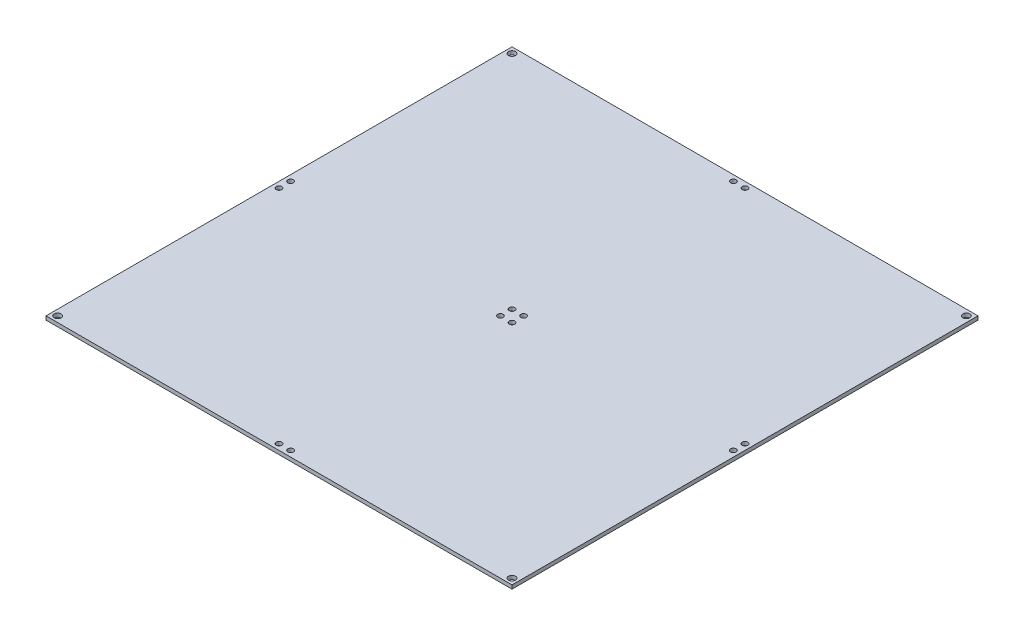
ISO-10303-21;
HEADER;
FILE_DESCRIPTION(('STEP AP214'),'2;1');
FILE_NAME('part.step','',(''),(''),'','','');
FILE_SCHEMA(('AUTOMOTIVE_DESIGN { 1 0 10303 214 1 1 1 1 }'));
ENDSEC;
DATA;
#1=APPLICATION_CONTEXT('core data for automotive mechanical design processes');
#2=APPLICATION_PROTOCOL_DEFINITION('international standard','automotive_design',2000,#1);
#3=PRODUCT_CONTEXT('',#1,'mechanical');
#4=PRODUCT('Part','Part','',(#3));
#5=PRODUCT_RELATED_PRODUCT_CATEGORY('part','',(#4));
#6=PRODUCT_DEFINITION_FORMATION('','',#4);
#7=PRODUCT_DEFINITION_CONTEXT('part definition',#1,'design');
#8=PRODUCT_DEFINITION('design','',#6,#7);
#9=PRODUCT_DEFINITION_SHAPE('','',#8);
#10=(LENGTH_UNIT() NAMED_UNIT(*) SI_UNIT(.MILLI.,.METRE.));
#11=(NAMED_UNIT(*) PLANE_ANGLE_UNIT() SI_UNIT($,.RADIAN.));
#12=(NAMED_UNIT(*) SI_UNIT($,.STERADIAN.) SOLID_ANGLE_UNIT());
#13=UNCERTAINTY_MEASURE_WITH_UNIT(LENGTH_MEASURE(1.E-05),#10,'distance_accuracy_value','');
#14=(GEOMETRIC_REPRESENTATION_CONTEXT(3) GLOBAL_UNCERTAINTY_ASSIGNED_CONTEXT((#13)) GLOBAL_UNIT_ASSIGNED_CONTEXT((#10,
#11,#12)) REPRESENTATION_CONTEXT('',''));
#15=CARTESIAN_POINT('',(0.,0.,0.));
#16=DIRECTION('',(0.,0.,1.));
#17=DIRECTION('',(1.,0.,0.));
#18=AXIS2_PLACEMENT_3D('',#15,#16,#17);
#19=CARTESIAN_POINT('',(0.,1.6,0.));
#20=DIRECTION('',(0.,-1.,0.));
#21=DIRECTION('',(0.,0.,-1.));
#22=AXIS2_PLACEMENT_3D('',#19,#20,#21);
#23=PLANE('',#22);
#24=CARTESIAN_POINT('',(2.50000000000002,1.6,97.5));
#25=DIRECTION('',(0.,1.,0.));
#26=DIRECTION('',(0.,0.,1.));
#27=AXIS2_PLACEMENT_3D('',#24,#25,#26);
#28=CIRCLE('',#27,1.19062499999999);
#29=CARTESIAN_POINT('',(2.50000000000002,1.6,98.690625));
#30=VERTEX_POINT('',#29);
#31=EDGE_CURVE('E204',#30,#30,#28,.T.);
#32=ORIENTED_EDGE('',*,*,#31,.F.);
#33=EDGE_LOOP('',(#32));
#34=FACE_BOUND('',#33,.T.);
#35=CARTESIAN_POINT('',(-2.5,1.6,97.5));
#36=DIRECTION('',(0.,1.,0.));
#37=DIRECTION('',(0.,0.,1.));
#38=AXIS2_PLACEMENT_3D('',#35,#36,#37);
#39=CIRCLE('',#38,1.19062499999999);
#40=CARTESIAN_POINT('',(-2.5,1.6,98.690625));
#41=VERTEX_POINT('',#40);
#42=EDGE_CURVE('E198',#41,#41,#39,.T.);
#43=ORIENTED_EDGE('',*,*,#42,.F.);
#44=EDGE_LOOP('',(#43));
#45=FACE_BOUND('',#44,.T.);
#46=CARTESIAN_POINT('',(2.50000000000001,1.6,2.49999999999998));
#47=DIRECTION('',(0.,1.,0.));
#48=DIRECTION('',(0.,0.,1.));
#49=AXIS2_PLACEMENT_3D('',#46,#47,#48);
#50=CIRCLE('',#49,1.19062499999999);
#51=CARTESIAN_POINT('',(2.50000000000001,1.6,3.69062499999997));
#52=VERTEX_POINT('',#51);
#53=EDGE_CURVE('E192',#52,#52,#50,.T.);
#54=ORIENTED_EDGE('',*,*,#53,.F.);
#55=EDGE_LOOP('',(#54));
#56=FACE_BOUND('',#55,.T.);
#57=CARTESIAN_POINT('',(-2.49999999999999,1.6,2.49999999999998));
#58=DIRECTION('',(0.,1.,0.));
#59=DIRECTION('',(0.,0.,1.));
#60=AXIS2_PLACEMENT_3D('',#57,#58,#59);
#61=CIRCLE('',#60,1.19062499999999);
#62=CARTESIAN_POINT('',(-2.49999999999999,1.6,3.69062499999997));
#63=VERTEX_POINT('',#62);
#64=EDGE_CURVE('E186',#63,#63,#61,.T.);
#65=ORIENTED_EDGE('',*,*,#64,.F.);
#66=EDGE_LOOP('',(#65));
#67=FACE_BOUND('',#66,.T.);
#68=CARTESIAN_POINT('',(-2.5,1.6,-2.5));
#69=DIRECTION('',(0.,1.,0.));
#70=DIRECTION('',(0.,0.,1.));
#71=AXIS2_PLACEMENT_3D('',#68,#69,#70);
#72=CIRCLE('',#71,1.19062499999999);
#73=CARTESIAN_POINT('',(-2.5,1.6,-1.30937500000001));
#74=VERTEX_POINT('',#73);
#75=EDGE_CURVE('E180',#74,#74,#72,.T.);
#76=ORIENTED_EDGE('',*,*,#75,.F.);
#77=EDGE_LOOP('',(#76));
#78=FACE_BOUND('',#77,.T.);
#79=CARTESIAN_POINT('',(2.50000000000002,1.6,-2.50000000000002));
#80=DIRECTION('',(0.,1.,0.));
#81=DIRECTION('',(0.,0.,1.));
#82=AXIS2_PLACEMENT_3D('',#79,#80,#81);
#83=CIRCLE('',#82,1.19062499999999);
#84=CARTESIAN_POINT('',(2.50000000000002,1.6,-1.30937500000004));
#85=VERTEX_POINT('',#84);
#86=EDGE_CURVE('E174',#85,#85,#83,.T.);
#87=ORIENTED_EDGE('',*,*,#86,.F.);
#88=EDGE_LOOP('',(#87));
#89=FACE_BOUND('',#88,.T.);
#90=CARTESIAN_POINT('',(-97.5,1.6,2.49999999999998));
#91=DIRECTION('',(0.,1.,0.));
#92=DIRECTION('',(0.,0.,1.));
#93=AXIS2_PLACEMENT_3D('',#90,#91,#92);
#94=CIRCLE('',#93,1.19062499999999);
#95=CARTESIAN_POINT('',(-97.5,1.6,3.69062499999997));
#96=VERTEX_POINT('',#95);
#97=EDGE_CURVE('E168',#96,#96,#94,.T.);
#98=ORIENTED_EDGE('',*,*,#97,.F.);
#99=EDGE_LOOP('',(#98));
#100=FACE_BOUND('',#99,.T.);
#101=CARTESIAN_POINT('',(-97.5,1.6,-2.5));
#102=DIRECTION('',(0.,1.,0.));
#103=DIRECTION('',(0.,0.,1.));
#104=AXIS2_PLACEMENT_3D('',#101,#102,#103);
#105=CIRCLE('',#104,1.19062499999999);
#106=CARTESIAN_POINT('',(-97.5,1.6,-1.30937500000001));
#107=VERTEX_POINT('',#106);
#108=EDGE_CURVE('E162',#107,#107,#105,.T.);
#109=ORIENTED_EDGE('',*,*,#108,.F.);
#110=EDGE_LOOP('',(#109));
#111=FACE_BOUND('',#110,.T.);
#112=CARTESIAN_POINT('',(97.5,1.6,2.49999999999998));
#113=DIRECTION('',(0.,1.,0.));
#114=DIRECTION('',(0.,0.,1.));
#115=AXIS2_PLACEMENT_3D('',#112,#113,#114);
#116=CIRCLE('',#115,1.19062499999999);
#117=CARTESIAN_POINT('',(97.5,1.6,3.69062499999997));
#118=VERTEX_POINT('',#117);
#119=EDGE_CURVE('E156',#118,#118,#116,.T.);
#120=ORIENTED_EDGE('',*,*,#119,.F.);
#121=EDGE_LOOP('',(#120));
#122=FACE_BOUND('',#121,.T.);
#123=CARTESIAN_POINT('',(97.5,1.6,-2.50000000000002));
#124=DIRECTION('',(0.,1.,0.));
#125=DIRECTION('',(0.,0.,1.));
#126=AXIS2_PLACEMENT_3D('',#123,#124,#125);
#127=CIRCLE('',#126,1.19062499999999);
#128=CARTESIAN_POINT('',(97.5,1.6,-1.30937500000004));
#129=VERTEX_POINT('',#128);
#130=EDGE_CURVE('E150',#129,#129,#127,.T.);
#131=ORIENTED_EDGE('',*,*,#130,.F.);
#132=EDGE_LOOP('',(#131));
#133=FACE_BOUND('',#132,.T.);
#134=CARTESIAN_POINT('',(2.50000000000001,1.6,-97.5000000000001));
#135=DIRECTION('',(0.,1.,0.));
#136=DIRECTION('',(0.,0.,1.));
#137=AXIS2_PLACEMENT_3D('',#134,#135,#136);
#138=CIRCLE('',#137,1.19062499999999);
#139=CARTESIAN_POINT('',(2.50000000000001,1.6,-96.3093750000001));
#140=VERTEX_POINT('',#139);
#141=EDGE_CURVE('E144',#140,#140,#138,.T.);
#142=ORIENTED_EDGE('',*,*,#141,.F.);
#143=EDGE_LOOP('',(#142));
#144=FACE_BOUND('',#143,.T.);
#145=CARTESIAN_POINT('',(-2.49999999999999,1.6,-97.5));
#146=DIRECTION('',(0.,1.,0.));
#147=DIRECTION('',(0.,0.,1.));
#148=AXIS2_PLACEMENT_3D('',#145,#146,#147);
#149=CIRCLE('',#148,1.19062499999999);
#150=CARTESIAN_POINT('',(-2.49999999999999,1.6,-96.309375));
#151=VERTEX_POINT('',#150);
#152=EDGE_CURVE('E138',#151,#151,#149,.T.);
#153=ORIENTED_EDGE('',*,*,#152,.F.);
#154=EDGE_LOOP('',(#153));
#155=FACE_BOUND('',#154,.T.);
#156=CARTESIAN_POINT('',(-97.5,1.6,97.5));
#157=DIRECTION('',(0.,1.,0.));
#158=DIRECTION('',(0.,0.,-1.));
#159=AXIS2_PLACEMENT_3D('',#156,#157,#158);
#160=CIRCLE('',#159,1.5);
#161=CARTESIAN_POINT('',(-97.5,1.6,96.));
#162=VERTEX_POINT('',#161);
#163=EDGE_CURVE('E121',#162,#162,#160,.T.);
#164=ORIENTED_EDGE('',*,*,#163,.F.);
#165=EDGE_LOOP('',(#164));
#166=FACE_BOUND('',#165,.T.);
#167=CARTESIAN_POINT('',(-97.5,1.6,-97.5));
#168=DIRECTION('',(0.,1.,0.));
#169=DIRECTION('',(0.,0.,1.));
#170=AXIS2_PLACEMENT_3D('',#167,#168,#169);
#171=CIRCLE('',#170,1.5);
#172=CARTESIAN_POINT('',(-97.5,1.6,-96.));
#173=VERTEX_POINT('',#172);
#174=EDGE_CURVE('E100',#173,#173,#171,.T.);
#175=ORIENTED_EDGE('',*,*,#174,.F.);
#176=EDGE_LOOP('',(#175));
#177=FACE_BOUND('',#176,.T.);
#178=DIRECTION('',(0.,0.,-1.));
#179=VECTOR('',#178,1.);
#180=CARTESIAN_POINT('',(100.,1.6,100.));
#181=LINE('',#180,#179);
#182=CARTESIAN_POINT('',(100.,1.6,100.));
#183=VERTEX_POINT('',#182);
#184=CARTESIAN_POINT('',(100.,1.6,-100.));
#185=VERTEX_POINT('',#184);
#186=EDGE_CURVE('E85',#183,#185,#181,.T.);
#187=ORIENTED_EDGE('',*,*,#186,.T.);
#188=DIRECTION('',(-1.,0.,0.));
#189=VECTOR('',#188,1.);
#190=CARTESIAN_POINT('',(-100.,1.6,-100.));
#191=LINE('',#190,#189);
#192=CARTESIAN_POINT('',(-100.,1.6,-100.));
#193=VERTEX_POINT('',#192);
#194=EDGE_CURVE('E80',#185,#193,#191,.T.);
#195=ORIENTED_EDGE('',*,*,#194,.T.);
#196=DIRECTION('',(0.,0.,1.));
#197=VECTOR('',#196,1.);
#198=CARTESIAN_POINT('',(-100.,1.6,100.));
#199=LINE('',#198,#197);
#200=CARTESIAN_POINT('',(-100.,1.6,100.));
#201=VERTEX_POINT('',#200);
#202=EDGE_CURVE('E83',#193,#201,#199,.T.);
#203=ORIENTED_EDGE('',*,*,#202,.T.);
#204=DIRECTION('',(1.,0.,0.));
#205=VECTOR('',#204,1.);
#206=CARTESIAN_POINT('',(-100.,1.6,100.));
#207=LINE('',#206,#205);
#208=EDGE_CURVE('E50',#201,#183,#207,.T.);
#209=ORIENTED_EDGE('',*,*,#208,.T.);
#210=EDGE_LOOP('',(#187,#195,#203,#209));
#211=FACE_BOUND('',#210,.T.);
#212=CARTESIAN_POINT('',(97.5,1.6,-97.5));
#213=DIRECTION('',(0.,1.,0.));
#214=DIRECTION('',(0.,0.,-1.));
#215=AXIS2_PLACEMENT_3D('',#212,#213,#214);
#216=CIRCLE('',#215,1.5);
#217=CARTESIAN_POINT('',(97.5,1.6,-99.));
#218=VERTEX_POINT('',#217);
#219=EDGE_CURVE('E115',#218,#218,#216,.T.);
#220=ORIENTED_EDGE('',*,*,#219,.F.);
#221=EDGE_LOOP('',(#220));
#222=FACE_BOUND('',#221,.T.);
#223=CARTESIAN_POINT('',(97.5,1.6,97.5));
#224=DIRECTION('',(0.,1.,0.));
#225=DIRECTION('',(0.,0.,1.));
#226=AXIS2_PLACEMENT_3D('',#223,#224,#225);
#227=CIRCLE('',#226,1.5);
#228=CARTESIAN_POINT('',(97.5,1.6,99.));
#229=VERTEX_POINT('',#228);
#230=EDGE_CURVE('E127',#229,#229,#227,.T.);
#231=ORIENTED_EDGE('',*,*,#230,.F.);
#232=EDGE_LOOP('',(#231));
#233=FACE_BOUND('',#232,.T.);
#234=ADVANCED_FACE('F33',(#34,#45,#56,#67,#78,#89,#100,#111,#122,#133,#144,#155,#166,#177,#211,
#222,#233),#23,.F.);
#235=CARTESIAN_POINT('',(0.,0.,0.));
#236=DIRECTION('',(0.,-1.,0.));
#237=DIRECTION('',(0.,0.,-1.));
#238=AXIS2_PLACEMENT_3D('',#235,#236,#237);
#239=PLANE('',#238);
#240=CARTESIAN_POINT('',(2.50000000000002,0.,97.5));
#241=DIRECTION('',(0.,1.,0.));
#242=DIRECTION('',(0.,0.,1.));
#243=AXIS2_PLACEMENT_3D('',#240,#241,#242);
#244=CIRCLE('',#243,1.190625);
#245=CARTESIAN_POINT('',(2.50000000000002,0.,98.690625));
#246=VERTEX_POINT('',#245);
#247=EDGE_CURVE('E201',#246,#246,#244,.T.);
#248=ORIENTED_EDGE('',*,*,#247,.T.);
#249=EDGE_LOOP('',(#248));
#250=FACE_BOUND('',#249,.T.);
#251=CARTESIAN_POINT('',(-2.5,0.,97.5));
#252=DIRECTION('',(0.,1.,0.));
#253=DIRECTION('',(0.,0.,1.));
#254=AXIS2_PLACEMENT_3D('',#251,#252,#253);
#255=CIRCLE('',#254,1.190625);
#256=CARTESIAN_POINT('',(-2.5,0.,98.690625));
#257=VERTEX_POINT('',#256);
#258=EDGE_CURVE('E195',#257,#257,#255,.T.);
#259=ORIENTED_EDGE('',*,*,#258,.T.);
#260=EDGE_LOOP('',(#259));
#261=FACE_BOUND('',#260,.T.);
#262=CARTESIAN_POINT('',(2.50000000000001,0.,2.49999999999998));
#263=DIRECTION('',(0.,1.,0.));
#264=DIRECTION('',(0.,0.,1.));
#265=AXIS2_PLACEMENT_3D('',#262,#263,#264);
#266=CIRCLE('',#265,1.190625);
#267=CARTESIAN_POINT('',(2.50000000000001,0.,3.69062499999998));
#268=VERTEX_POINT('',#267);
#269=EDGE_CURVE('E189',#268,#268,#266,.T.);
#270=ORIENTED_EDGE('',*,*,#269,.T.);
#271=EDGE_LOOP('',(#270));
#272=FACE_BOUND('',#271,.T.);
#273=CARTESIAN_POINT('',(-2.49999999999999,0.,2.49999999999998));
#274=DIRECTION('',(0.,1.,0.));
#275=DIRECTION('',(0.,0.,1.));
#276=AXIS2_PLACEMENT_3D('',#273,#274,#275);
#277=CIRCLE('',#276,1.190625);
#278=CARTESIAN_POINT('',(-2.49999999999999,0.,3.69062499999998));
#279=VERTEX_POINT('',#278);
#280=EDGE_CURVE('E183',#279,#279,#277,.T.);
#281=ORIENTED_EDGE('',*,*,#280,.T.);
#282=EDGE_LOOP('',(#281));
#283=FACE_BOUND('',#282,.T.);
#284=CARTESIAN_POINT('',(-2.5,0.,-2.5));
#285=DIRECTION('',(0.,1.,0.));
#286=DIRECTION('',(0.,0.,1.));
#287=AXIS2_PLACEMENT_3D('',#284,#285,#286);
#288=CIRCLE('',#287,1.190625);
#289=CARTESIAN_POINT('',(-2.5,0.,-1.309375));
#290=VERTEX_POINT('',#289);
#291=EDGE_CURVE('E177',#290,#290,#288,.T.);
#292=ORIENTED_EDGE('',*,*,#291,.T.);
#293=EDGE_LOOP('',(#292));
#294=FACE_BOUND('',#293,.T.);
#295=CARTESIAN_POINT('',(2.50000000000002,0.,-2.50000000000002));
#296=DIRECTION('',(0.,1.,0.));
#297=DIRECTION('',(0.,0.,1.));
#298=AXIS2_PLACEMENT_3D('',#295,#296,#297);
#299=CIRCLE('',#298,1.190625);
#300=CARTESIAN_POINT('',(2.50000000000002,0.,-1.30937500000002));
#301=VERTEX_POINT('',#300);
#302=EDGE_CURVE('E171',#301,#301,#299,.T.);
#303=ORIENTED_EDGE('',*,*,#302,.T.);
#304=EDGE_LOOP('',(#303));
#305=FACE_BOUND('',#304,.T.);
#306=CARTESIAN_POINT('',(-97.5,0.,2.49999999999998));
#307=DIRECTION('',(0.,1.,0.));
#308=DIRECTION('',(0.,0.,1.));
#309=AXIS2_PLACEMENT_3D('',#306,#307,#308);
#310=CIRCLE('',#309,1.190625);
#311=CARTESIAN_POINT('',(-97.5,0.,3.69062499999998));
#312=VERTEX_POINT('',#311);
#313=EDGE_CURVE('E165',#312,#312,#310,.T.);
#314=ORIENTED_EDGE('',*,*,#313,.T.);
#315=EDGE_LOOP('',(#314));
#316=FACE_BOUND('',#315,.T.);
#317=CARTESIAN_POINT('',(-97.5,0.,-2.5));
#318=DIRECTION('',(0.,1.,0.));
#319=DIRECTION('',(0.,0.,1.));
#320=AXIS2_PLACEMENT_3D('',#317,#318,#319);
#321=CIRCLE('',#320,1.190625);
#322=CARTESIAN_POINT('',(-97.5,0.,-1.30937499999999));
#323=VERTEX_POINT('',#322);
#324=EDGE_CURVE('E159',#323,#323,#321,.T.);
#325=ORIENTED_EDGE('',*,*,#324,.T.);
#326=EDGE_LOOP('',(#325));
#327=FACE_BOUND('',#326,.T.);
#328=CARTESIAN_POINT('',(97.5,0.,2.49999999999998));
#329=DIRECTION('',(0.,1.,0.));
#330=DIRECTION('',(0.,0.,1.));
#331=AXIS2_PLACEMENT_3D('',#328,#329,#330);
#332=CIRCLE('',#331,1.190625);
#333=CARTESIAN_POINT('',(97.5,0.,3.69062499999998));
#334=VERTEX_POINT('',#333);
#335=EDGE_CURVE('E153',#334,#334,#332,.T.);
#336=ORIENTED_EDGE('',*,*,#335,.T.);
#337=EDGE_LOOP('',(#336));
#338=FACE_BOUND('',#337,.T.);
#339=CARTESIAN_POINT('',(97.5,0.,-2.50000000000002));
#340=DIRECTION('',(0.,1.,0.));
#341=DIRECTION('',(0.,0.,1.));
#342=AXIS2_PLACEMENT_3D('',#339,#340,#341);
#343=CIRCLE('',#342,1.190625);
#344=CARTESIAN_POINT('',(97.5,0.,-1.30937500000002));
#345=VERTEX_POINT('',#344);
#346=EDGE_CURVE('E147',#345,#345,#343,.T.);
#347=ORIENTED_EDGE('',*,*,#346,.T.);
#348=EDGE_LOOP('',(#347));
#349=FACE_BOUND('',#348,.T.);
#350=CARTESIAN_POINT('',(2.50000000000001,0.,-97.5000000000001));
#351=DIRECTION('',(0.,1.,0.));
#352=DIRECTION('',(0.,0.,1.));
#353=AXIS2_PLACEMENT_3D('',#350,#351,#352);
#354=CIRCLE('',#353,1.190625);
#355=CARTESIAN_POINT('',(2.50000000000001,0.,-96.3093750000001));
#356=VERTEX_POINT('',#355);
#357=EDGE_CURVE('E141',#356,#356,#354,.T.);
#358=ORIENTED_EDGE('',*,*,#357,.T.);
#359=EDGE_LOOP('',(#358));
#360=FACE_BOUND('',#359,.T.);
#361=CARTESIAN_POINT('',(-2.49999999999999,0.,-97.5));
#362=DIRECTION('',(0.,1.,0.));
#363=DIRECTION('',(0.,0.,1.));
#364=AXIS2_PLACEMENT_3D('',#361,#362,#363);
#365=CIRCLE('',#364,1.190625);
#366=CARTESIAN_POINT('',(-2.49999999999999,0.,-96.309375));
#367=VERTEX_POINT('',#366);
#368=EDGE_CURVE('E133',#367,#367,#365,.T.);
#369=ORIENTED_EDGE('',*,*,#368,.T.);
#370=EDGE_LOOP('',(#369));
#371=FACE_BOUND('',#370,.T.);
#372=CARTESIAN_POINT('',(-97.5,0.,97.5));
#373=DIRECTION('',(0.,1.,0.));
#374=DIRECTION('',(0.,0.,-1.));
#375=AXIS2_PLACEMENT_3D('',#372,#373,#374);
#376=CIRCLE('',#375,1.5);
#377=CARTESIAN_POINT('',(-97.5,0.,96.));
#378=VERTEX_POINT('',#377);
#379=EDGE_CURVE('E124',#378,#378,#376,.T.);
#380=ORIENTED_EDGE('',*,*,#379,.T.);
#381=EDGE_LOOP('',(#380));
#382=FACE_BOUND('',#381,.T.);
#383=CARTESIAN_POINT('',(-97.5,0.,-97.5));
#384=DIRECTION('',(0.,1.,0.));
#385=DIRECTION('',(0.,0.,1.));
#386=AXIS2_PLACEMENT_3D('',#383,#384,#385);
#387=CIRCLE('',#386,1.5);
#388=CARTESIAN_POINT('',(-97.5,0.,-96.));
#389=VERTEX_POINT('',#388);
#390=EDGE_CURVE('E112',#389,#389,#387,.T.);
#391=ORIENTED_EDGE('',*,*,#390,.T.);
#392=EDGE_LOOP('',(#391));
#393=FACE_BOUND('',#392,.T.);
#394=DIRECTION('',(0.,0.,-1.));
#395=VECTOR('',#394,1.);
#396=CARTESIAN_POINT('',(100.,0.,100.));
#397=LINE('',#396,#395);
#398=CARTESIAN_POINT('',(100.,0.,100.));
#399=VERTEX_POINT('',#398);
#400=CARTESIAN_POINT('',(100.,0.,-100.));
#401=VERTEX_POINT('',#400);
#402=EDGE_CURVE('E97',#399,#401,#397,.T.);
#403=ORIENTED_EDGE('',*,*,#402,.F.);
#404=DIRECTION('',(1.,0.,0.));
#405=VECTOR('',#404,1.);
#406=CARTESIAN_POINT('',(-100.,0.,100.));
#407=LINE('',#406,#405);
#408=CARTESIAN_POINT('',(-100.,0.,100.));
#409=VERTEX_POINT('',#408);
#410=EDGE_CURVE('E73',#409,#399,#407,.T.);
#411=ORIENTED_EDGE('',*,*,#410,.F.);
#412=DIRECTION('',(0.,0.,1.));
#413=VECTOR('',#412,1.);
#414=CARTESIAN_POINT('',(-100.,0.,100.));
#415=LINE('',#414,#413);
#416=CARTESIAN_POINT('',(-100.,0.,-100.));
#417=VERTEX_POINT('',#416);
#418=EDGE_CURVE('E67',#417,#409,#415,.T.);
#419=ORIENTED_EDGE('',*,*,#418,.F.);
#420=DIRECTION('',(-1.,0.,0.));
#421=VECTOR('',#420,1.);
#422=CARTESIAN_POINT('',(-100.,0.,-100.));
#423=LINE('',#422,#421);
#424=EDGE_CURVE('E89',#401,#417,#423,.T.);
#425=ORIENTED_EDGE('',*,*,#424,.F.);
#426=EDGE_LOOP('',(#403,#411,#419,#425));
#427=FACE_BOUND('',#426,.T.);
#428=CARTESIAN_POINT('',(97.5,0.,-97.5));
#429=DIRECTION('',(0.,1.,0.));
#430=DIRECTION('',(0.,0.,-1.));
#431=AXIS2_PLACEMENT_3D('',#428,#429,#430);
#432=CIRCLE('',#431,1.5);
#433=CARTESIAN_POINT('',(97.5,0.,-99.));
#434=VERTEX_POINT('',#433);
#435=EDGE_CURVE('E118',#434,#434,#432,.T.);
#436=ORIENTED_EDGE('',*,*,#435,.T.);
#437=EDGE_LOOP('',(#436));
#438=FACE_BOUND('',#437,.T.);
#439=CARTESIAN_POINT('',(97.5,0.,97.5));
#440=DIRECTION('',(0.,1.,0.));
#441=DIRECTION('',(0.,0.,1.));
#442=AXIS2_PLACEMENT_3D('',#439,#440,#441);
#443=CIRCLE('',#442,1.5);
#444=CARTESIAN_POINT('',(97.5,0.,99.));
#445=VERTEX_POINT('',#444);
#446=EDGE_CURVE('E130',#445,#445,#443,.T.);
#447=ORIENTED_EDGE('',*,*,#446,.T.);
#448=EDGE_LOOP('',(#447));
#449=FACE_BOUND('',#448,.T.);
#450=ADVANCED_FACE('F108',(#250,#261,#272,#283,#294,#305,#316,#327,#338,#349,#360,#371,#382,
#393,#427,#438,#449),#239,.T.);
#451=CARTESIAN_POINT('',(100.,1.6,100.));
#452=DIRECTION('',(-1.,0.,0.));
#453=DIRECTION('',(0.,0.,1.));
#454=AXIS2_PLACEMENT_3D('',#451,#452,#453);
#455=PLANE('',#454);
#456=ORIENTED_EDGE('',*,*,#402,.T.);
#457=DIRECTION('',(0.,-1.,0.));
#458=VECTOR('',#457,1.);
#459=CARTESIAN_POINT('',(100.,1.6,-100.));
#460=LINE('',#459,#458);
#461=EDGE_CURVE('E11',#185,#401,#460,.T.);
#462=ORIENTED_EDGE('',*,*,#461,.F.);
#463=ORIENTED_EDGE('',*,*,#186,.F.);
#464=DIRECTION('',(0.,-1.,0.));
#465=VECTOR('',#464,1.);
#466=CARTESIAN_POINT('',(100.,1.6,100.));
#467=LINE('',#466,#465);
#468=EDGE_CURVE('E93',#183,#399,#467,.T.);
#469=ORIENTED_EDGE('',*,*,#468,.T.);
#470=EDGE_LOOP('',(#456,#462,#463,#469));
#471=FACE_BOUND('',#470,.T.);
#472=ADVANCED_FACE('F35',(#471),#455,.F.);
#473=CARTESIAN_POINT('',(-100.,1.6,-100.));
#474=DIRECTION('',(0.,0.,1.));
#475=DIRECTION('',(1.,0.,0.));
#476=AXIS2_PLACEMENT_3D('',#473,#474,#475);
#477=PLANE('',#476);
#478=ORIENTED_EDGE('',*,*,#424,.T.);
#479=DIRECTION('',(0.,-1.,0.));
#480=VECTOR('',#479,1.);
#481=CARTESIAN_POINT('',(-100.,1.6,-100.));
#482=LINE('',#481,#480);
#483=EDGE_CURVE('E42',#193,#417,#482,.T.);
#484=ORIENTED_EDGE('',*,*,#483,.F.);
#485=ORIENTED_EDGE('',*,*,#194,.F.);
#486=ORIENTED_EDGE('',*,*,#461,.T.);
#487=EDGE_LOOP('',(#478,#484,#485,#486));
#488=FACE_BOUND('',#487,.T.);
#489=ADVANCED_FACE('F88',(#488),#477,.F.);
#490=CARTESIAN_POINT('',(-100.,1.6,100.));
#491=DIRECTION('',(1.,0.,0.));
#492=DIRECTION('',(0.,0.,-1.));
#493=AXIS2_PLACEMENT_3D('',#490,#491,#492);
#494=PLANE('',#493);
#495=ORIENTED_EDGE('',*,*,#418,.T.);
#496=DIRECTION('',(0.,-1.,0.));
#497=VECTOR('',#496,1.);
#498=CARTESIAN_POINT('',(-100.,1.6,100.));
#499=LINE('',#498,#497);
#500=EDGE_CURVE('E90',#201,#409,#499,.T.);
#501=ORIENTED_EDGE('',*,*,#500,.F.);
#502=ORIENTED_EDGE('',*,*,#202,.F.);
#503=ORIENTED_EDGE('',*,*,#483,.T.);
#504=EDGE_LOOP('',(#495,#501,#502,#503));
#505=FACE_BOUND('',#504,.T.);
#506=ADVANCED_FACE('F91',(#505),#494,.F.);
#507=CARTESIAN_POINT('',(-100.,1.6,100.));
#508=DIRECTION('',(0.,0.,-1.));
#509=DIRECTION('',(-1.,0.,0.));
#510=AXIS2_PLACEMENT_3D('',#507,#508,#509);
#511=PLANE('',#510);
#512=ORIENTED_EDGE('',*,*,#410,.T.);
#513=ORIENTED_EDGE('',*,*,#468,.F.);
#514=ORIENTED_EDGE('',*,*,#208,.F.);
#515=ORIENTED_EDGE('',*,*,#500,.T.);
#516=EDGE_LOOP('',(#512,#513,#514,#515));
#517=FACE_BOUND('',#516,.T.);
#518=ADVANCED_FACE('F105',(#517),#511,.F.);
#519=CARTESIAN_POINT('',(-97.5,1.6,-97.5));
#520=DIRECTION('',(0.,-1.,0.));
#521=DIRECTION('',(0.,0.,-1.));
#522=AXIS2_PLACEMENT_3D('',#519,#520,#521);
#523=CYLINDRICAL_SURFACE('',#522,1.5);
#524=ORIENTED_EDGE('',*,*,#174,.T.);
#525=EDGE_LOOP('',(#524));
#526=FACE_BOUND('',#525,.T.);
#527=ORIENTED_EDGE('',*,*,#390,.F.);
#528=EDGE_LOOP('',(#527));
#529=FACE_BOUND('',#528,.T.);
#530=ADVANCED_FACE('F239',(#526,#529),#523,.F.);
#531=CARTESIAN_POINT('',(97.5,1.6,-97.5));
#532=DIRECTION('',(0.,-1.,0.));
#533=DIRECTION('',(0.,0.,-1.));
#534=AXIS2_PLACEMENT_3D('',#531,#532,#533);
#535=CYLINDRICAL_SURFACE('',#534,1.5);
#536=ORIENTED_EDGE('',*,*,#219,.T.);
#537=EDGE_LOOP('',(#536));
#538=FACE_BOUND('',#537,.T.);
#539=ORIENTED_EDGE('',*,*,#435,.F.);
#540=EDGE_LOOP('',(#539));
#541=FACE_BOUND('',#540,.T.);
#542=ADVANCED_FACE('F242',(#538,#541),#535,.F.);
#543=CARTESIAN_POINT('',(-97.5,1.6,97.5));
#544=DIRECTION('',(0.,-1.,0.));
#545=DIRECTION('',(0.,0.,-1.));
#546=AXIS2_PLACEMENT_3D('',#543,#544,#545);
#547=CYLINDRICAL_SURFACE('',#546,1.5);
#548=ORIENTED_EDGE('',*,*,#163,.T.);
#549=EDGE_LOOP('',(#548));
#550=FACE_BOUND('',#549,.T.);
#551=ORIENTED_EDGE('',*,*,#379,.F.);
#552=EDGE_LOOP('',(#551));
#553=FACE_BOUND('',#552,.T.);
#554=ADVANCED_FACE('F280',(#550,#553),#547,.F.);
#555=CARTESIAN_POINT('',(97.5,1.6,97.5));
#556=DIRECTION('',(0.,-1.,0.));
#557=DIRECTION('',(0.,0.,-1.));
#558=AXIS2_PLACEMENT_3D('',#555,#556,#557);
#559=CYLINDRICAL_SURFACE('',#558,1.5);
#560=ORIENTED_EDGE('',*,*,#230,.T.);
#561=EDGE_LOOP('',(#560));
#562=FACE_BOUND('',#561,.T.);
#563=ORIENTED_EDGE('',*,*,#446,.F.);
#564=EDGE_LOOP('',(#563));
#565=FACE_BOUND('',#564,.T.);
#566=ADVANCED_FACE('F288',(#562,#565),#559,.F.);
#567=CARTESIAN_POINT('',(-2.49999999999999,1.6,-97.5));
#568=DIRECTION('',(0.,1.,0.));
#569=DIRECTION('',(0.,0.,1.));
#570=AXIS2_PLACEMENT_3D('',#567,#568,#569);
#571=CYLINDRICAL_SURFACE('',#570,1.19062499999999);
#572=ORIENTED_EDGE('',*,*,#368,.F.);
#573=EDGE_LOOP('',(#572));
#574=FACE_BOUND('',#573,.T.);
#575=ORIENTED_EDGE('',*,*,#152,.T.);
#576=EDGE_LOOP('',(#575));
#577=FACE_BOUND('',#576,.T.);
#578=ADVANCED_FACE('F296',(#574,#577),#571,.F.);
#579=CARTESIAN_POINT('',(2.50000000000001,1.6,-97.5000000000001));
#580=DIRECTION('',(0.,1.,0.));
#581=DIRECTION('',(0.,0.,1.));
#582=AXIS2_PLACEMENT_3D('',#579,#580,#581);
#583=CYLINDRICAL_SURFACE('',#582,1.19062499999999);
#584=ORIENTED_EDGE('',*,*,#357,.F.);
#585=EDGE_LOOP('',(#584));
#586=FACE_BOUND('',#585,.T.);
#587=ORIENTED_EDGE('',*,*,#141,.T.);
#588=EDGE_LOOP('',(#587));
#589=FACE_BOUND('',#588,.T.);
#590=ADVANCED_FACE('F305',(#586,#589),#583,.F.);
#591=CARTESIAN_POINT('',(97.5,1.6,-2.50000000000002));
#592=DIRECTION('',(0.,1.,0.));
#593=DIRECTION('',(0.,0.,1.));
#594=AXIS2_PLACEMENT_3D('',#591,#592,#593);
#595=CYLINDRICAL_SURFACE('',#594,1.19062499999999);
#596=ORIENTED_EDGE('',*,*,#346,.F.);
#597=EDGE_LOOP('',(#596));
#598=FACE_BOUND('',#597,.T.);
#599=ORIENTED_EDGE('',*,*,#130,.T.);
#600=EDGE_LOOP('',(#599));
#601=FACE_BOUND('',#600,.T.);
#602=ADVANCED_FACE('F313',(#598,#601),#595,.F.);
#603=CARTESIAN_POINT('',(97.5,1.6,2.49999999999998));
#604=DIRECTION('',(0.,1.,0.));
#605=DIRECTION('',(0.,0.,1.));
#606=AXIS2_PLACEMENT_3D('',#603,#604,#605);
#607=CYLINDRICAL_SURFACE('',#606,1.19062499999999);
#608=ORIENTED_EDGE('',*,*,#335,.F.);
#609=EDGE_LOOP('',(#608));
#610=FACE_BOUND('',#609,.T.);
#611=ORIENTED_EDGE('',*,*,#119,.T.);
#612=EDGE_LOOP('',(#611));
#613=FACE_BOUND('',#612,.T.);
#614=ADVANCED_FACE('F321',(#610,#613),#607,.F.);
#615=CARTESIAN_POINT('',(-97.5,1.6,-2.5));
#616=DIRECTION('',(0.,1.,0.));
#617=DIRECTION('',(0.,0.,1.));
#618=AXIS2_PLACEMENT_3D('',#615,#616,#617);
#619=CYLINDRICAL_SURFACE('',#618,1.19062499999999);
#620=ORIENTED_EDGE('',*,*,#324,.F.);
#621=EDGE_LOOP('',(#620));
#622=FACE_BOUND('',#621,.T.);
#623=ORIENTED_EDGE('',*,*,#108,.T.);
#624=EDGE_LOOP('',(#623));
#625=FACE_BOUND('',#624,.T.);
#626=ADVANCED_FACE('F329',(#622,#625),#619,.F.);
#627=CARTESIAN_POINT('',(-97.5,1.6,2.49999999999998));
#628=DIRECTION('',(0.,1.,0.));
#629=DIRECTION('',(0.,0.,1.));
#630=AXIS2_PLACEMENT_3D('',#627,#628,#629);
#631=CYLINDRICAL_SURFACE('',#630,1.19062499999999);
#632=ORIENTED_EDGE('',*,*,#313,.F.);
#633=EDGE_LOOP('',(#632));
#634=FACE_BOUND('',#633,.T.);
#635=ORIENTED_EDGE('',*,*,#97,.T.);
#636=EDGE_LOOP('',(#635));
#637=FACE_BOUND('',#636,.T.);
#638=ADVANCED_FACE('F337',(#634,#637),#631,.F.);
#639=CARTESIAN_POINT('',(2.50000000000002,1.6,-2.50000000000002));
#640=DIRECTION('',(0.,1.,0.));
#641=DIRECTION('',(0.,0.,1.));
#642=AXIS2_PLACEMENT_3D('',#639,#640,#641);
#643=CYLINDRICAL_SURFACE('',#642,1.19062499999999);
#644=ORIENTED_EDGE('',*,*,#302,.F.);
#645=EDGE_LOOP('',(#644));
#646=FACE_BOUND('',#645,.T.);
#647=ORIENTED_EDGE('',*,*,#86,.T.);
#648=EDGE_LOOP('',(#647));
#649=FACE_BOUND('',#648,.T.);
#650=ADVANCED_FACE('F345',(#646,#649),#643,.F.);
#651=CARTESIAN_POINT('',(-2.5,1.6,-2.5));
#652=DIRECTION('',(0.,1.,0.));
#653=DIRECTION('',(0.,0.,1.));
#654=AXIS2_PLACEMENT_3D('',#651,#652,#653);
#655=CYLINDRICAL_SURFACE('',#654,1.19062499999999);
#656=ORIENTED_EDGE('',*,*,#291,.F.);
#657=EDGE_LOOP('',(#656));
#658=FACE_BOUND('',#657,.T.);
#659=ORIENTED_EDGE('',*,*,#75,.T.);
#660=EDGE_LOOP('',(#659));
#661=FACE_BOUND('',#660,.T.);
#662=ADVANCED_FACE('F353',(#658,#661),#655,.F.);
#663=CARTESIAN_POINT('',(-2.49999999999999,1.6,2.49999999999998));
#664=DIRECTION('',(0.,1.,0.));
#665=DIRECTION('',(0.,0.,1.));
#666=AXIS2_PLACEMENT_3D('',#663,#664,#665);
#667=CYLINDRICAL_SURFACE('',#666,1.19062499999999);
#668=ORIENTED_EDGE('',*,*,#280,.F.);
#669=EDGE_LOOP('',(#668));
#670=FACE_BOUND('',#669,.T.);
#671=ORIENTED_EDGE('',*,*,#64,.T.);
#672=EDGE_LOOP('',(#671));
#673=FACE_BOUND('',#672,.T.);
#674=ADVANCED_FACE('F361',(#670,#673),#667,.F.);
#675=CARTESIAN_POINT('',(2.50000000000001,1.6,2.49999999999998));
#676=DIRECTION('',(0.,1.,0.));
#677=DIRECTION('',(0.,0.,1.));
#678=AXIS2_PLACEMENT_3D('',#675,#676,#677);
#679=CYLINDRICAL_SURFACE('',#678,1.19062499999999);
#680=ORIENTED_EDGE('',*,*,#269,.F.);
#681=EDGE_LOOP('',(#680));
#682=FACE_BOUND('',#681,.T.);
#683=ORIENTED_EDGE('',*,*,#53,.T.);
#684=EDGE_LOOP('',(#683));
#685=FACE_BOUND('',#684,.T.);
#686=ADVANCED_FACE('F369',(#682,#685),#679,.F.);
#687=CARTESIAN_POINT('',(-2.5,1.6,97.5));
#688=DIRECTION('',(0.,1.,0.));
#689=DIRECTION('',(0.,0.,1.));
#690=AXIS2_PLACEMENT_3D('',#687,#688,#689);
#691=CYLINDRICAL_SURFACE('',#690,1.19062499999999);
#692=ORIENTED_EDGE('',*,*,#258,.F.);
#693=EDGE_LOOP('',(#692));
#694=FACE_BOUND('',#693,.T.);
#695=ORIENTED_EDGE('',*,*,#42,.T.);
#696=EDGE_LOOP('',(#695));
#697=FACE_BOUND('',#696,.T.);
#698=ADVANCED_FACE('F377',(#694,#697),#691,.F.);
#699=CARTESIAN_POINT('',(2.50000000000002,1.6,97.5));
#700=DIRECTION('',(0.,1.,0.));
#701=DIRECTION('',(0.,0.,1.));
#702=AXIS2_PLACEMENT_3D('',#699,#700,#701);
#703=CYLINDRICAL_SURFACE('',#702,1.19062499999999);
#704=ORIENTED_EDGE('',*,*,#247,.F.);
#705=EDGE_LOOP('',(#704));
#706=FACE_BOUND('',#705,.T.);
#707=ORIENTED_EDGE('',*,*,#31,.T.);
#708=EDGE_LOOP('',(#707));
#709=FACE_BOUND('',#708,.T.);
#710=ADVANCED_FACE('F208',(#706,#709),#703,.F.);
#711=CLOSED_SHELL('',(#234,#450,#472,#489,#506,#518,#530,#542,#554,#566,#578,#590,#602,#614,
#626,#638,#650,#662,#674,#686,#698,#710));
#712=MANIFOLD_SOLID_BREP('B2',#711);
#713=ADVANCED_BREP_SHAPE_REPRESENTATION('',(#18,#712),#14);
#714=SHAPE_DEFINITION_REPRESENTATION(#9,#713);
ENDSEC;
END-ISO-10303-21;
